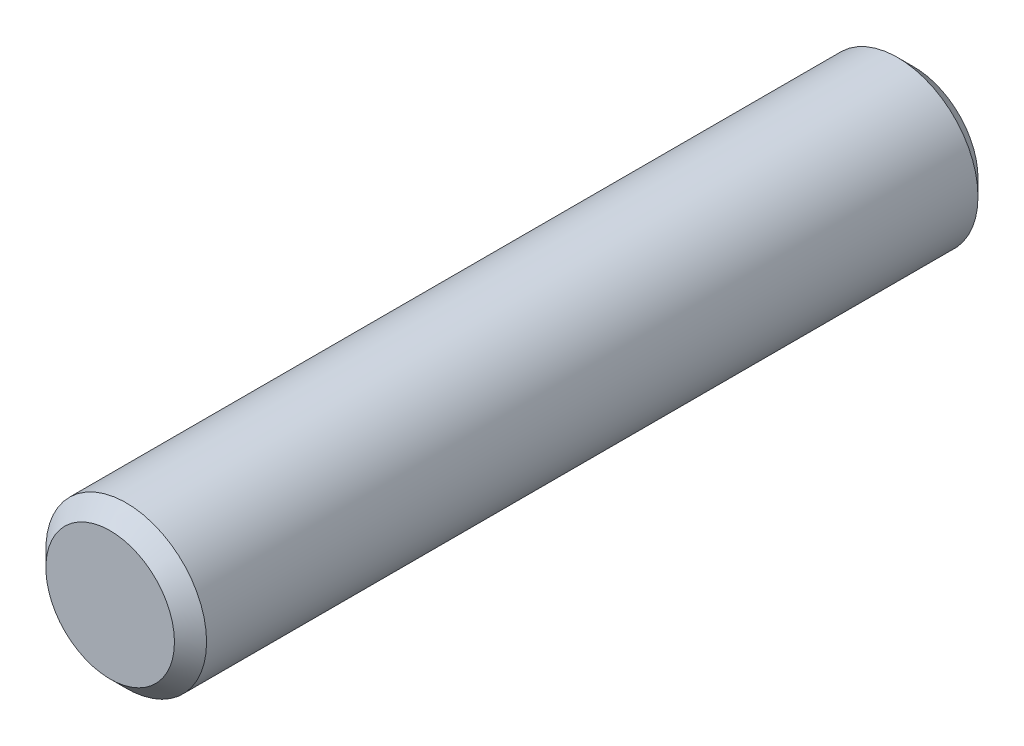
ISO-10303-21;
HEADER;
FILE_DESCRIPTION(('STEP AP214'),'2;1');
FILE_NAME('part.step','',(''),(''),'','','');
FILE_SCHEMA(('AUTOMOTIVE_DESIGN { 1 0 10303 214 1 1 1 1 }'));
ENDSEC;
DATA;
#1=APPLICATION_CONTEXT('core data for automotive mechanical design processes');
#2=APPLICATION_PROTOCOL_DEFINITION('international standard','automotive_design',2000,#1);
#3=PRODUCT_CONTEXT('',#1,'mechanical');
#4=PRODUCT('Part','Part','',(#3));
#5=PRODUCT_RELATED_PRODUCT_CATEGORY('part','',(#4));
#6=PRODUCT_DEFINITION_FORMATION('','',#4);
#7=PRODUCT_DEFINITION_CONTEXT('part definition',#1,'design');
#8=PRODUCT_DEFINITION('design','',#6,#7);
#9=PRODUCT_DEFINITION_SHAPE('','',#8);
#10=(LENGTH_UNIT() NAMED_UNIT(*) SI_UNIT(.MILLI.,.METRE.));
#11=(NAMED_UNIT(*) PLANE_ANGLE_UNIT() SI_UNIT($,.RADIAN.));
#12=(NAMED_UNIT(*) SI_UNIT($,.STERADIAN.) SOLID_ANGLE_UNIT());
#13=UNCERTAINTY_MEASURE_WITH_UNIT(LENGTH_MEASURE(1.E-05),#10,'distance_accuracy_value','');
#14=(GEOMETRIC_REPRESENTATION_CONTEXT(3) GLOBAL_UNCERTAINTY_ASSIGNED_CONTEXT((#13)) GLOBAL_UNIT_ASSIGNED_CONTEXT((#10,
#11,#12)) REPRESENTATION_CONTEXT('',''));
#15=CARTESIAN_POINT('',(0.,0.,0.));
#16=DIRECTION('',(0.,0.,1.));
#17=DIRECTION('',(1.,0.,0.));
#18=AXIS2_PLACEMENT_3D('',#15,#16,#17);
#19=CARTESIAN_POINT('',(0.,0.,6.35));
#20=DIRECTION('',(0.,0.,-1.));
#21=DIRECTION('',(-1.,0.,0.));
#22=AXIS2_PLACEMENT_3D('',#19,#20,#21);
#23=CYLINDRICAL_SURFACE('',#22,1.27);
#24=CARTESIAN_POINT('',(0.,0.,-6.096));
#25=DIRECTION('',(0.,0.,1.));
#26=DIRECTION('',(1.,0.,0.));
#27=AXIS2_PLACEMENT_3D('',#24,#25,#26);
#28=CIRCLE('',#27,1.27);
#29=CARTESIAN_POINT('',(1.27,0.,-6.096));
#30=VERTEX_POINT('',#29);
#31=EDGE_CURVE('E42',#30,#30,#28,.T.);
#32=ORIENTED_EDGE('',*,*,#31,.T.);
#33=EDGE_LOOP('',(#32));
#34=FACE_BOUND('',#33,.T.);
#35=CARTESIAN_POINT('',(0.,0.,6.096));
#36=DIRECTION('',(0.,0.,1.));
#37=DIRECTION('',(1.,0.,0.));
#38=AXIS2_PLACEMENT_3D('',#35,#36,#37);
#39=CIRCLE('',#38,1.27);
#40=CARTESIAN_POINT('',(1.27,0.,6.096));
#41=VERTEX_POINT('',#40);
#42=EDGE_CURVE('E46',#41,#41,#39,.F.);
#43=ORIENTED_EDGE('',*,*,#42,.T.);
#44=EDGE_LOOP('',(#43));
#45=FACE_BOUND('',#44,.T.);
#46=ADVANCED_FACE('F31',(#34,#45),#23,.T.);
#47=CARTESIAN_POINT('',(0.,0.,6.35));
#48=DIRECTION('',(0.,0.,1.));
#49=DIRECTION('',(1.,0.,0.));
#50=AXIS2_PLACEMENT_3D('',#47,#48,#49);
#51=PLANE('',#50);
#52=CARTESIAN_POINT('',(0.,0.,6.35));
#53=DIRECTION('',(0.,0.,1.));
#54=DIRECTION('',(1.,0.,0.));
#55=AXIS2_PLACEMENT_3D('',#52,#53,#54);
#56=CIRCLE('',#55,1.016);
#57=CARTESIAN_POINT('',(1.016,0.,6.35));
#58=VERTEX_POINT('',#57);
#59=EDGE_CURVE('E10',#58,#58,#56,.T.);
#60=ORIENTED_EDGE('',*,*,#59,.T.);
#61=EDGE_LOOP('',(#60));
#62=FACE_BOUND('',#61,.T.);
#63=ADVANCED_FACE('F62',(#62),#51,.T.);
#64=CARTESIAN_POINT('',(0.,0.,-6.35));
#65=DIRECTION('',(0.,0.,1.));
#66=DIRECTION('',(1.,0.,0.));
#67=AXIS2_PLACEMENT_3D('',#64,#65,#66);
#68=PLANE('',#67);
#69=CARTESIAN_POINT('',(0.,0.,-6.35));
#70=DIRECTION('',(0.,0.,1.));
#71=DIRECTION('',(1.,0.,0.));
#72=AXIS2_PLACEMENT_3D('',#69,#70,#71);
#73=CIRCLE('',#72,1.016);
#74=CARTESIAN_POINT('',(1.016,0.,-6.35));
#75=VERTEX_POINT('',#74);
#76=EDGE_CURVE('E38',#75,#75,#73,.F.);
#77=ORIENTED_EDGE('',*,*,#76,.T.);
#78=EDGE_LOOP('',(#77));
#79=FACE_BOUND('',#78,.T.);
#80=ADVANCED_FACE('F59',(#79),#68,.F.);
#81=CARTESIAN_POINT('',(0.,0.,-6.096));
#82=DIRECTION('',(0.,0.,1.));
#83=DIRECTION('',(1.,0.,0.));
#84=AXIS2_PLACEMENT_3D('',#81,#82,#83);
#85=CONICAL_SURFACE('',#84,1.27,0.785398163397449);
#86=ORIENTED_EDGE('',*,*,#76,.F.);
#87=EDGE_LOOP('',(#86));
#88=FACE_BOUND('',#87,.T.);
#89=ORIENTED_EDGE('',*,*,#31,.F.);
#90=EDGE_LOOP('',(#89));
#91=FACE_BOUND('',#90,.T.);
#92=ADVANCED_FACE('F55',(#88,#91),#85,.T.);
#93=CARTESIAN_POINT('',(0.,0.,6.35));
#94=DIRECTION('',(0.,0.,-1.));
#95=DIRECTION('',(-1.,0.,0.));
#96=AXIS2_PLACEMENT_3D('',#93,#94,#95);
#97=CONICAL_SURFACE('',#96,1.016,0.78539816339745);
#98=ORIENTED_EDGE('',*,*,#42,.F.);
#99=EDGE_LOOP('',(#98));
#100=FACE_BOUND('',#99,.T.);
#101=ORIENTED_EDGE('',*,*,#59,.F.);
#102=EDGE_LOOP('',(#101));
#103=FACE_BOUND('',#102,.T.);
#104=ADVANCED_FACE('F33',(#100,#103),#97,.T.);
#105=CLOSED_SHELL('',(#46,#63,#80,#92,#104));
#106=MANIFOLD_SOLID_BREP('B2',#105);
#107=ADVANCED_BREP_SHAPE_REPRESENTATION('',(#18,#106),#14);
#108=SHAPE_DEFINITION_REPRESENTATION(#9,#107);
ENDSEC;
END-ISO-10303-21;
